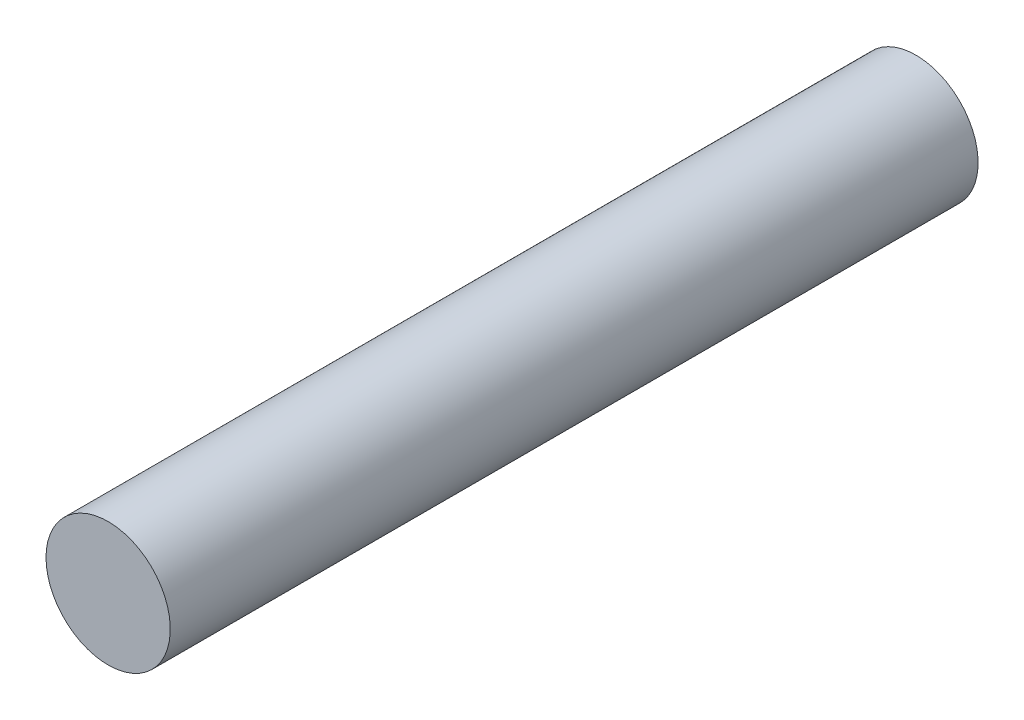
ISO-10303-21;
HEADER;
FILE_DESCRIPTION(('STEP AP214'),'2;1');
FILE_NAME('part.step','',(''),(''),'','','');
FILE_SCHEMA(('AUTOMOTIVE_DESIGN { 1 0 10303 214 1 1 1 1 }'));
ENDSEC;
DATA;
#1=APPLICATION_CONTEXT('core data for automotive mechanical design processes');
#2=APPLICATION_PROTOCOL_DEFINITION('international standard','automotive_design',2000,#1);
#3=PRODUCT_CONTEXT('',#1,'mechanical');
#4=PRODUCT('Part','Part','',(#3));
#5=PRODUCT_RELATED_PRODUCT_CATEGORY('part','',(#4));
#6=PRODUCT_DEFINITION_FORMATION('','',#4);
#7=PRODUCT_DEFINITION_CONTEXT('part definition',#1,'design');
#8=PRODUCT_DEFINITION('design','',#6,#7);
#9=PRODUCT_DEFINITION_SHAPE('','',#8);
#10=(LENGTH_UNIT() NAMED_UNIT(*) SI_UNIT(.MILLI.,.METRE.));
#11=(NAMED_UNIT(*) PLANE_ANGLE_UNIT() SI_UNIT($,.RADIAN.));
#12=(NAMED_UNIT(*) SI_UNIT($,.STERADIAN.) SOLID_ANGLE_UNIT());
#13=UNCERTAINTY_MEASURE_WITH_UNIT(LENGTH_MEASURE(1.E-05),#10,'distance_accuracy_value','');
#14=(GEOMETRIC_REPRESENTATION_CONTEXT(3) GLOBAL_UNCERTAINTY_ASSIGNED_CONTEXT((#13)) GLOBAL_UNIT_ASSIGNED_CONTEXT((#10,
#11,#12)) REPRESENTATION_CONTEXT('',''));
#15=CARTESIAN_POINT('',(0.,0.,0.));
#16=DIRECTION('',(0.,0.,1.));
#17=DIRECTION('',(1.,0.,0.));
#18=AXIS2_PLACEMENT_3D('',#15,#16,#17);
#19=CARTESIAN_POINT('',(0.,0.,13.));
#20=DIRECTION('',(0.,0.,-1.));
#21=DIRECTION('',(-1.,0.,0.));
#22=AXIS2_PLACEMENT_3D('',#19,#20,#21);
#23=CYLINDRICAL_SURFACE('',#22,1.);
#24=CARTESIAN_POINT('',(0.,0.,13.));
#25=DIRECTION('',(0.,0.,1.));
#26=DIRECTION('',(1.,0.,0.));
#27=AXIS2_PLACEMENT_3D('',#24,#25,#26);
#28=CIRCLE('',#27,1.);
#29=CARTESIAN_POINT('',(-1.,0.,13.));
#30=VERTEX_POINT('',#29);
#31=EDGE_CURVE('E10',#30,#30,#28,.T.);
#32=CARTESIAN_POINT('',(0.,0.,0.));
#33=DIRECTION('',(0.,0.,1.));
#34=DIRECTION('',(1.,0.,0.));
#35=AXIS2_PLACEMENT_3D('',#32,#33,#34);
#36=CIRCLE('',#35,1.);
#37=CARTESIAN_POINT('',(-1.,0.,0.));
#38=VERTEX_POINT('',#37);
#39=EDGE_CURVE('E38',#38,#38,#36,.T.);
#40=CARTESIAN_POINT('',(-1.,0.,13.));
#41=CARTESIAN_POINT('',(-1.,0.,12.8645833333333));
#42=CARTESIAN_POINT('',(-1.,0.,12.7291666666667));
#43=CARTESIAN_POINT('',(-1.,0.,12.4583333333333));
#44=CARTESIAN_POINT('',(-1.,0.,12.3229166666667));
#45=CARTESIAN_POINT('',(-1.,0.,12.0520833333333));
#46=CARTESIAN_POINT('',(-1.,0.,11.9166666666667));
#47=CARTESIAN_POINT('',(-1.,0.,11.6458333333333));
#48=CARTESIAN_POINT('',(-1.,0.,11.5104166666667));
#49=CARTESIAN_POINT('',(-1.,0.,11.2395833333333));
#50=CARTESIAN_POINT('',(-1.,0.,11.1041666666667));
#51=CARTESIAN_POINT('',(-1.,0.,10.8333333333333));
#52=CARTESIAN_POINT('',(-1.,0.,10.6979166666667));
#53=CARTESIAN_POINT('',(-1.,0.,10.4270833333333));
#54=CARTESIAN_POINT('',(-1.,0.,10.2916666666667));
#55=CARTESIAN_POINT('',(-1.,0.,10.0208333333333));
#56=CARTESIAN_POINT('',(-1.,0.,9.88541666666667));
#57=CARTESIAN_POINT('',(-1.,0.,9.61458333333333));
#58=CARTESIAN_POINT('',(-1.,0.,9.47916666666667));
#59=CARTESIAN_POINT('',(-1.,0.,9.20833333333333));
#60=CARTESIAN_POINT('',(-1.,0.,9.07291666666666));
#61=CARTESIAN_POINT('',(-1.,0.,8.80208333333333));
#62=CARTESIAN_POINT('',(-1.,0.,8.66666666666667));
#63=CARTESIAN_POINT('',(-1.,0.,8.39583333333333));
#64=CARTESIAN_POINT('',(-1.,0.,8.26041666666667));
#65=CARTESIAN_POINT('',(-1.,0.,7.98958333333333));
#66=CARTESIAN_POINT('',(-1.,0.,7.85416666666667));
#67=CARTESIAN_POINT('',(-1.,0.,7.58333333333333));
#68=CARTESIAN_POINT('',(-1.,0.,7.44791666666667));
#69=CARTESIAN_POINT('',(-1.,0.,7.17708333333333));
#70=CARTESIAN_POINT('',(-1.,0.,7.04166666666667));
#71=CARTESIAN_POINT('',(-1.,0.,6.77083333333333));
#72=CARTESIAN_POINT('',(-1.,0.,6.63541666666667));
#73=CARTESIAN_POINT('',(-1.,0.,6.36458333333333));
#74=CARTESIAN_POINT('',(-1.,0.,6.22916666666667));
#75=CARTESIAN_POINT('',(-1.,0.,5.95833333333333));
#76=CARTESIAN_POINT('',(-1.,0.,5.82291666666667));
#77=CARTESIAN_POINT('',(-1.,0.,5.55208333333333));
#78=CARTESIAN_POINT('',(-1.,0.,5.41666666666667));
#79=CARTESIAN_POINT('',(-1.,0.,5.14583333333333));
#80=CARTESIAN_POINT('',(-1.,0.,5.01041666666667));
#81=CARTESIAN_POINT('',(-1.,0.,4.73958333333333));
#82=CARTESIAN_POINT('',(-1.,0.,4.60416666666667));
#83=CARTESIAN_POINT('',(-1.,0.,4.33333333333333));
#84=CARTESIAN_POINT('',(-1.,0.,4.19791666666667));
#85=CARTESIAN_POINT('',(-1.,0.,3.92708333333333));
#86=CARTESIAN_POINT('',(-1.,0.,3.79166666666667));
#87=CARTESIAN_POINT('',(-1.,0.,3.52083333333333));
#88=CARTESIAN_POINT('',(-1.,0.,3.38541666666667));
#89=CARTESIAN_POINT('',(-1.,0.,3.11458333333333));
#90=CARTESIAN_POINT('',(-1.,0.,2.97916666666667));
#91=CARTESIAN_POINT('',(-1.,0.,2.70833333333333));
#92=CARTESIAN_POINT('',(-1.,0.,2.57291666666667));
#93=CARTESIAN_POINT('',(-1.,0.,2.30208333333333));
#94=CARTESIAN_POINT('',(-1.,0.,2.16666666666667));
#95=CARTESIAN_POINT('',(-1.,0.,1.89583333333333));
#96=CARTESIAN_POINT('',(-1.,0.,1.76041666666667));
#97=CARTESIAN_POINT('',(-1.,0.,1.48958333333333));
#98=CARTESIAN_POINT('',(-1.,0.,1.35416666666667));
#99=CARTESIAN_POINT('',(-1.,0.,1.08333333333333));
#100=CARTESIAN_POINT('',(-1.,0.,0.947916666666667));
#101=CARTESIAN_POINT('',(-1.,0.,0.677083333333334));
#102=CARTESIAN_POINT('',(-1.,0.,0.541666666666667));
#103=CARTESIAN_POINT('',(-1.,0.,0.270833333333334));
#104=CARTESIAN_POINT('',(-1.,0.,0.135416666666667));
#105=CARTESIAN_POINT('',(-1.,0.,0.));
#106=B_SPLINE_CURVE_WITH_KNOTS('',3,(#40,#41,#42,#43,#44,#45,#46,#47,#48,#49,#50,#51,#52,#53,
#54,#55,#56,#57,#58,#59,#60,#61,#62,#63,#64,#65,#66,#67,#68,#69,#70,#71,#72,#73,#74,#75,#76,#77,
#78,#79,#80,#81,#82,#83,#84,#85,#86,#87,#88,#89,#90,#91,#92,#93,#94,#95,#96,#97,#98,#99,#100,
#101,#102,#103,#104,#105),.UNSPECIFIED.,.F.,.F.,(4,2,2,2,2,2,2,2,2,2,2,2,2,2,2,2,2,2,2,2,2,2,2,
2,2,2,2,2,2,2,2,2,4),(0.,0.40625,0.812500000000001,1.21875,1.625,2.03125,2.4375,2.84375,3.25,
3.65625,4.0625,4.46875,4.875,5.28125,5.6875,6.09375,6.5,6.90625,7.3125,7.71875,8.125,8.53125,
8.9375,9.34375,9.75,10.15625,10.5625,10.96875,11.375,11.78125,12.1875,12.59375,13.),.UNSPECIFIED.);
#107=EDGE_CURVE('BSEAM35',#30,#38,#106,.T.);
#108=ORIENTED_EDGE('',*,*,#31,.F.);
#109=ORIENTED_EDGE('',*,*,#39,.T.);
#110=ORIENTED_EDGE('',*,*,#107,.T.);
#111=ORIENTED_EDGE('',*,*,#107,.F.);
#112=EDGE_LOOP('',(#108,#110,#109,#111));
#113=FACE_BOUND('',#112,.T.);
#114=ADVANCED_FACE('F35',(#113),#23,.T.);
#115=CARTESIAN_POINT('',(0.,0.,13.));
#116=DIRECTION('',(0.,0.,1.));
#117=DIRECTION('',(1.,0.,0.));
#118=AXIS2_PLACEMENT_3D('',#115,#116,#117);
#119=PLANE('',#118);
#120=ORIENTED_EDGE('',*,*,#31,.T.);
#121=EDGE_LOOP('',(#120));
#122=FACE_BOUND('',#121,.T.);
#123=ADVANCED_FACE('F52',(#122),#119,.T.);
#124=CARTESIAN_POINT('',(0.,0.,0.));
#125=DIRECTION('',(0.,0.,1.));
#126=DIRECTION('',(1.,0.,0.));
#127=AXIS2_PLACEMENT_3D('',#124,#125,#126);
#128=PLANE('',#127);
#129=ORIENTED_EDGE('',*,*,#39,.F.);
#130=EDGE_LOOP('',(#129));
#131=FACE_BOUND('',#130,.T.);
#132=ADVANCED_FACE('F50',(#131),#128,.F.);
#133=CLOSED_SHELL('',(#114,#123,#132));
#134=MANIFOLD_SOLID_BREP('B2',#133);
#135=ADVANCED_BREP_SHAPE_REPRESENTATION('',(#18,#134),#14);
#136=SHAPE_DEFINITION_REPRESENTATION(#9,#135);
ENDSEC;
END-ISO-10303-21;
